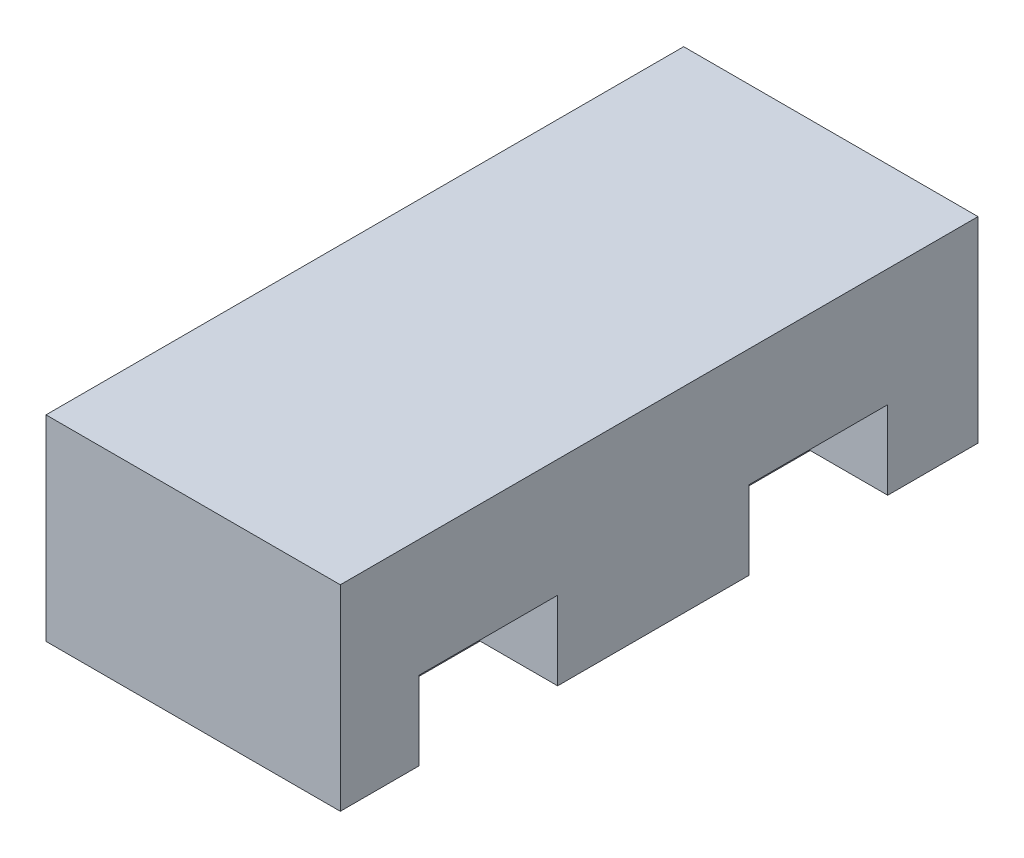
ISO-10303-21;
HEADER;
FILE_DESCRIPTION(('STEP AP214'),'2;1');
FILE_NAME('part.step','',(''),(''),'','','');
FILE_SCHEMA(('AUTOMOTIVE_DESIGN { 1 0 10303 214 1 1 1 1 }'));
ENDSEC;
DATA;
#1=APPLICATION_CONTEXT('core data for automotive mechanical design processes');
#2=APPLICATION_PROTOCOL_DEFINITION('international standard','automotive_design',2000,#1);
#3=PRODUCT_CONTEXT('',#1,'mechanical');
#4=PRODUCT('Part','Part','',(#3));
#5=PRODUCT_RELATED_PRODUCT_CATEGORY('part','',(#4));
#6=PRODUCT_DEFINITION_FORMATION('','',#4);
#7=PRODUCT_DEFINITION_CONTEXT('part definition',#1,'design');
#8=PRODUCT_DEFINITION('design','',#6,#7);
#9=PRODUCT_DEFINITION_SHAPE('','',#8);
#10=(LENGTH_UNIT() NAMED_UNIT(*) SI_UNIT(.MILLI.,.METRE.));
#11=(NAMED_UNIT(*) PLANE_ANGLE_UNIT() SI_UNIT($,.RADIAN.));
#12=(NAMED_UNIT(*) SI_UNIT($,.STERADIAN.) SOLID_ANGLE_UNIT());
#13=UNCERTAINTY_MEASURE_WITH_UNIT(LENGTH_MEASURE(1.E-05),#10,'distance_accuracy_value','');
#14=(GEOMETRIC_REPRESENTATION_CONTEXT(3) GLOBAL_UNCERTAINTY_ASSIGNED_CONTEXT((#13)) GLOBAL_UNIT_ASSIGNED_CONTEXT((#10,
#11,#12)) REPRESENTATION_CONTEXT('',''));
#15=CARTESIAN_POINT('',(0.,0.,0.));
#16=DIRECTION('',(0.,0.,1.));
#17=DIRECTION('',(1.,0.,0.));
#18=AXIS2_PLACEMENT_3D('',#15,#16,#17);
#19=CARTESIAN_POINT('',(-15.,20.,32.5));
#20=DIRECTION('',(-1.,0.,0.));
#21=DIRECTION('',(0.,0.,1.));
#22=AXIS2_PLACEMENT_3D('',#19,#20,#21);
#23=PLANE('',#22);
#24=DIRECTION('',(0.,0.,-1.));
#25=VECTOR('',#24,1.);
#26=CARTESIAN_POINT('',(-15.,0.,32.5));
#27=LINE('',#26,#25);
#28=CARTESIAN_POINT('',(-15.,0.,-23.3));
#29=VERTEX_POINT('',#28);
#30=CARTESIAN_POINT('',(-15.,0.,-32.5));
#31=VERTEX_POINT('',#30);
#32=EDGE_CURVE('E289',#29,#31,#27,.T.);
#33=ORIENTED_EDGE('',*,*,#32,.F.);
#34=DIRECTION('',(0.,-1.,0.));
#35=VECTOR('',#34,1.);
#36=CARTESIAN_POINT('',(-15.,8.,-23.3));
#37=LINE('',#36,#35);
#38=CARTESIAN_POINT('',(-15.,8.,-23.3));
#39=VERTEX_POINT('',#38);
#40=EDGE_CURVE('E211',#39,#29,#37,.T.);
#41=ORIENTED_EDGE('',*,*,#40,.F.);
#42=DIRECTION('',(0.,0.,-1.));
#43=VECTOR('',#42,1.);
#44=CARTESIAN_POINT('',(-15.,8.,0.));
#45=LINE('',#44,#43);
#46=CARTESIAN_POINT('',(-15.,8.,-9.15));
#47=VERTEX_POINT('',#46);
#48=EDGE_CURVE('E195',#47,#39,#45,.T.);
#49=ORIENTED_EDGE('',*,*,#48,.F.);
#50=DIRECTION('',(0.,-1.,0.));
#51=VECTOR('',#50,1.);
#52=CARTESIAN_POINT('',(-15.,8.,-9.15));
#53=LINE('',#52,#51);
#54=CARTESIAN_POINT('',(-15.,0.,-9.15));
#55=VERTEX_POINT('',#54);
#56=EDGE_CURVE('E214',#47,#55,#53,.T.);
#57=ORIENTED_EDGE('',*,*,#56,.T.);
#58=CARTESIAN_POINT('',(-15.,0.,10.35));
#59=VERTEX_POINT('',#58);
#60=EDGE_CURVE('E312',#59,#55,#27,.T.);
#61=ORIENTED_EDGE('',*,*,#60,.F.);
#62=DIRECTION('',(0.,-1.,0.));
#63=VECTOR('',#62,1.);
#64=CARTESIAN_POINT('',(-15.,8.,10.35));
#65=LINE('',#64,#63);
#66=CARTESIAN_POINT('',(-15.,8.,10.35));
#67=VERTEX_POINT('',#66);
#68=EDGE_CURVE('E290',#67,#59,#65,.T.);
#69=ORIENTED_EDGE('',*,*,#68,.F.);
#70=DIRECTION('',(0.,0.,-1.));
#71=VECTOR('',#70,1.);
#72=CARTESIAN_POINT('',(-15.,8.,0.));
#73=LINE('',#72,#71);
#74=CARTESIAN_POINT('',(-15.,8.,24.5));
#75=VERTEX_POINT('',#74);
#76=EDGE_CURVE('E275',#75,#67,#73,.T.);
#77=ORIENTED_EDGE('',*,*,#76,.F.);
#78=DIRECTION('',(0.,-1.,0.));
#79=VECTOR('',#78,1.);
#80=CARTESIAN_POINT('',(-15.,8.,24.5));
#81=LINE('',#80,#79);
#82=CARTESIAN_POINT('',(-15.,0.,24.5));
#83=VERTEX_POINT('',#82);
#84=EDGE_CURVE('E292',#75,#83,#81,.T.);
#85=ORIENTED_EDGE('',*,*,#84,.T.);
#86=CARTESIAN_POINT('',(-15.,0.,32.5));
#87=VERTEX_POINT('',#86);
#88=EDGE_CURVE('E308',#87,#83,#27,.T.);
#89=ORIENTED_EDGE('',*,*,#88,.F.);
#90=DIRECTION('',(0.,-1.,0.));
#91=VECTOR('',#90,1.);
#92=CARTESIAN_POINT('',(-15.,20.,32.5));
#93=LINE('',#92,#91);
#94=CARTESIAN_POINT('',(-15.,20.,32.5));
#95=VERTEX_POINT('',#94);
#96=EDGE_CURVE('E11',#95,#87,#93,.T.);
#97=ORIENTED_EDGE('',*,*,#96,.F.);
#98=DIRECTION('',(0.,0.,-1.));
#99=VECTOR('',#98,1.);
#100=CARTESIAN_POINT('',(-15.,20.,32.5));
#101=LINE('',#100,#99);
#102=CARTESIAN_POINT('',(-15.,20.,-32.5));
#103=VERTEX_POINT('',#102);
#104=EDGE_CURVE('E297',#95,#103,#101,.T.);
#105=ORIENTED_EDGE('',*,*,#104,.T.);
#106=DIRECTION('',(0.,-1.,0.));
#107=VECTOR('',#106,1.);
#108=CARTESIAN_POINT('',(-15.,20.,-32.5));
#109=LINE('',#108,#107);
#110=EDGE_CURVE('E42',#103,#31,#109,.T.);
#111=ORIENTED_EDGE('',*,*,#110,.T.);
#112=EDGE_LOOP('',(#33,#41,#49,#57,#61,#69,#77,#85,#89,#97,#105,#111));
#113=FACE_BOUND('',#112,.T.);
#114=ADVANCED_FACE('F39',(#113),#23,.T.);
#115=CARTESIAN_POINT('',(15.,20.,32.5));
#116=DIRECTION('',(-1.,0.,0.));
#117=DIRECTION('',(0.,0.,1.));
#118=AXIS2_PLACEMENT_3D('',#115,#116,#117);
#119=PLANE('',#118);
#120=DIRECTION('',(0.,-1.,0.));
#121=VECTOR('',#120,1.);
#122=CARTESIAN_POINT('',(15.,8.,24.5));
#123=LINE('',#122,#121);
#124=CARTESIAN_POINT('',(15.,8.,24.5));
#125=VERTEX_POINT('',#124);
#126=CARTESIAN_POINT('',(15.,0.,24.5));
#127=VERTEX_POINT('',#126);
#128=EDGE_CURVE('E233',#125,#127,#123,.T.);
#129=ORIENTED_EDGE('',*,*,#128,.F.);
#130=DIRECTION('',(0.,0.,1.));
#131=VECTOR('',#130,1.);
#132=CARTESIAN_POINT('',(15.,8.,0.));
#133=LINE('',#132,#131);
#134=CARTESIAN_POINT('',(15.,8.,10.35));
#135=VERTEX_POINT('',#134);
#136=EDGE_CURVE('E253',#135,#125,#133,.T.);
#137=ORIENTED_EDGE('',*,*,#136,.F.);
#138=DIRECTION('',(0.,-1.,0.));
#139=VECTOR('',#138,1.);
#140=CARTESIAN_POINT('',(15.,8.,10.35));
#141=LINE('',#140,#139);
#142=CARTESIAN_POINT('',(15.,0.,10.35));
#143=VERTEX_POINT('',#142);
#144=EDGE_CURVE('E263',#135,#143,#141,.T.);
#145=ORIENTED_EDGE('',*,*,#144,.T.);
#146=DIRECTION('',(0.,0.,-1.));
#147=VECTOR('',#146,1.);
#148=CARTESIAN_POINT('',(15.,0.,32.5));
#149=LINE('',#148,#147);
#150=CARTESIAN_POINT('',(15.,0.,-9.15));
#151=VERTEX_POINT('',#150);
#152=EDGE_CURVE('E319',#143,#151,#149,.T.);
#153=ORIENTED_EDGE('',*,*,#152,.T.);
#154=DIRECTION('',(0.,-1.,0.));
#155=VECTOR('',#154,1.);
#156=CARTESIAN_POINT('',(15.,8.,-9.15));
#157=LINE('',#156,#155);
#158=CARTESIAN_POINT('',(15.,8.,-9.15));
#159=VERTEX_POINT('',#158);
#160=EDGE_CURVE('E238',#159,#151,#157,.T.);
#161=ORIENTED_EDGE('',*,*,#160,.F.);
#162=DIRECTION('',(0.,0.,1.));
#163=VECTOR('',#162,1.);
#164=CARTESIAN_POINT('',(15.,8.,0.));
#165=LINE('',#164,#163);
#166=CARTESIAN_POINT('',(15.,8.,-23.3));
#167=VERTEX_POINT('',#166);
#168=EDGE_CURVE('E225',#167,#159,#165,.T.);
#169=ORIENTED_EDGE('',*,*,#168,.F.);
#170=DIRECTION('',(0.,-1.,0.));
#171=VECTOR('',#170,1.);
#172=CARTESIAN_POINT('',(15.,8.,-23.3));
#173=LINE('',#172,#171);
#174=CARTESIAN_POINT('',(15.,0.,-23.3));
#175=VERTEX_POINT('',#174);
#176=EDGE_CURVE('E240',#167,#175,#173,.T.);
#177=ORIENTED_EDGE('',*,*,#176,.T.);
#178=CARTESIAN_POINT('',(15.,0.,-32.5));
#179=VERTEX_POINT('',#178);
#180=EDGE_CURVE('E315',#175,#179,#149,.T.);
#181=ORIENTED_EDGE('',*,*,#180,.T.);
#182=DIRECTION('',(0.,-1.,0.));
#183=VECTOR('',#182,1.);
#184=CARTESIAN_POINT('',(15.,20.,-32.5));
#185=LINE('',#184,#183);
#186=CARTESIAN_POINT('',(15.,20.,-32.5));
#187=VERTEX_POINT('',#186);
#188=EDGE_CURVE('E322',#187,#179,#185,.T.);
#189=ORIENTED_EDGE('',*,*,#188,.F.);
#190=DIRECTION('',(0.,0.,-1.));
#191=VECTOR('',#190,1.);
#192=CARTESIAN_POINT('',(15.,20.,32.5));
#193=LINE('',#192,#191);
#194=CARTESIAN_POINT('',(15.,20.,32.5));
#195=VERTEX_POINT('',#194);
#196=EDGE_CURVE('E304',#195,#187,#193,.T.);
#197=ORIENTED_EDGE('',*,*,#196,.F.);
#198=DIRECTION('',(0.,-1.,0.));
#199=VECTOR('',#198,1.);
#200=CARTESIAN_POINT('',(15.,20.,32.5));
#201=LINE('',#200,#199);
#202=CARTESIAN_POINT('',(15.,0.,32.5));
#203=VERTEX_POINT('',#202);
#204=EDGE_CURVE('E47',#195,#203,#201,.T.);
#205=ORIENTED_EDGE('',*,*,#204,.T.);
#206=EDGE_CURVE('E316',#203,#127,#149,.T.);
#207=ORIENTED_EDGE('',*,*,#206,.T.);
#208=EDGE_LOOP('',(#129,#137,#145,#153,#161,#169,#177,#181,#189,#197,#205,#207));
#209=FACE_BOUND('',#208,.T.);
#210=ADVANCED_FACE('F356',(#209),#119,.F.);
#211=CARTESIAN_POINT('',(0.,0.,0.));
#212=DIRECTION('',(0.,-1.,0.));
#213=DIRECTION('',(0.,0.,-1.));
#214=AXIS2_PLACEMENT_3D('',#211,#212,#213);
#215=PLANE('',#214);
#216=DIRECTION('',(0.,0.,-1.));
#217=VECTOR('',#216,1.);
#218=CARTESIAN_POINT('',(7.1,0.,0.));
#219=LINE('',#218,#217);
#220=CARTESIAN_POINT('',(7.1,0.,24.5));
#221=VERTEX_POINT('',#220);
#222=CARTESIAN_POINT('',(7.1,0.,10.35));
#223=VERTEX_POINT('',#222);
#224=EDGE_CURVE('E258',#221,#223,#219,.T.);
#225=ORIENTED_EDGE('',*,*,#224,.F.);
#226=DIRECTION('',(1.,0.,0.));
#227=VECTOR('',#226,1.);
#228=CARTESIAN_POINT('',(0.,0.,24.5));
#229=LINE('',#228,#227);
#230=EDGE_CURVE('E55',#221,#127,#229,.T.);
#231=ORIENTED_EDGE('',*,*,#230,.T.);
#232=ORIENTED_EDGE('',*,*,#206,.F.);
#233=DIRECTION('',(1.,0.,0.));
#234=VECTOR('',#233,1.);
#235=CARTESIAN_POINT('',(-15.,0.,32.5));
#236=LINE('',#235,#234);
#237=EDGE_CURVE('E301',#87,#203,#236,.T.);
#238=ORIENTED_EDGE('',*,*,#237,.F.);
#239=ORIENTED_EDGE('',*,*,#88,.T.);
#240=DIRECTION('',(-1.,0.,0.));
#241=VECTOR('',#240,1.);
#242=CARTESIAN_POINT('',(0.,0.,24.5));
#243=LINE('',#242,#241);
#244=CARTESIAN_POINT('',(-7.1,0.,24.5));
#245=VERTEX_POINT('',#244);
#246=EDGE_CURVE('E283',#245,#83,#243,.T.);
#247=ORIENTED_EDGE('',*,*,#246,.F.);
#248=DIRECTION('',(0.,0.,-1.));
#249=VECTOR('',#248,1.);
#250=CARTESIAN_POINT('',(-7.1,0.,0.));
#251=LINE('',#250,#249);
#252=CARTESIAN_POINT('',(-7.1,0.,10.35));
#253=VERTEX_POINT('',#252);
#254=EDGE_CURVE('E213',#245,#253,#251,.T.);
#255=ORIENTED_EDGE('',*,*,#254,.T.);
#256=DIRECTION('',(1.,0.,0.));
#257=VECTOR('',#256,1.);
#258=CARTESIAN_POINT('',(0.,0.,10.35));
#259=LINE('',#258,#257);
#260=EDGE_CURVE('E272',#59,#253,#259,.T.);
#261=ORIENTED_EDGE('',*,*,#260,.F.);
#262=ORIENTED_EDGE('',*,*,#60,.T.);
#263=DIRECTION('',(1.,0.,0.));
#264=VECTOR('',#263,1.);
#265=CARTESIAN_POINT('',(0.,0.,-9.15));
#266=LINE('',#265,#264);
#267=CARTESIAN_POINT('',(-7.1,0.,-9.15));
#268=VERTEX_POINT('',#267);
#269=EDGE_CURVE('E200',#55,#268,#266,.T.);
#270=ORIENTED_EDGE('',*,*,#269,.T.);
#271=DIRECTION('',(0.,0.,-1.));
#272=VECTOR('',#271,1.);
#273=CARTESIAN_POINT('',(-7.1,0.,0.));
#274=LINE('',#273,#272);
#275=CARTESIAN_POINT('',(-7.1,0.,-23.3));
#276=VERTEX_POINT('',#275);
#277=EDGE_CURVE('E203',#268,#276,#274,.T.);
#278=ORIENTED_EDGE('',*,*,#277,.T.);
#279=DIRECTION('',(-1.,0.,0.));
#280=VECTOR('',#279,1.);
#281=CARTESIAN_POINT('',(0.,0.,-23.3));
#282=LINE('',#281,#280);
#283=EDGE_CURVE('E194',#276,#29,#282,.T.);
#284=ORIENTED_EDGE('',*,*,#283,.T.);
#285=ORIENTED_EDGE('',*,*,#32,.T.);
#286=DIRECTION('',(1.,0.,0.));
#287=VECTOR('',#286,1.);
#288=CARTESIAN_POINT('',(-15.,0.,-32.5));
#289=LINE('',#288,#287);
#290=EDGE_CURVE('E311',#31,#179,#289,.T.);
#291=ORIENTED_EDGE('',*,*,#290,.T.);
#292=ORIENTED_EDGE('',*,*,#180,.F.);
#293=DIRECTION('',(1.,0.,0.));
#294=VECTOR('',#293,1.);
#295=CARTESIAN_POINT('',(0.,0.,-23.3));
#296=LINE('',#295,#294);
#297=CARTESIAN_POINT('',(7.1,0.,-23.3));
#298=VERTEX_POINT('',#297);
#299=EDGE_CURVE('E232',#298,#175,#296,.T.);
#300=ORIENTED_EDGE('',*,*,#299,.F.);
#301=DIRECTION('',(0.,0.,-1.));
#302=VECTOR('',#301,1.);
#303=CARTESIAN_POINT('',(7.1,0.,0.));
#304=LINE('',#303,#302);
#305=CARTESIAN_POINT('',(7.1,0.,-9.15));
#306=VERTEX_POINT('',#305);
#307=EDGE_CURVE('E63',#306,#298,#304,.T.);
#308=ORIENTED_EDGE('',*,*,#307,.F.);
#309=DIRECTION('',(1.,0.,0.));
#310=VECTOR('',#309,1.);
#311=CARTESIAN_POINT('',(0.,0.,-9.15));
#312=LINE('',#311,#310);
#313=EDGE_CURVE('E222',#306,#151,#312,.T.);
#314=ORIENTED_EDGE('',*,*,#313,.T.);
#315=ORIENTED_EDGE('',*,*,#152,.F.);
#316=DIRECTION('',(1.,0.,0.));
#317=VECTOR('',#316,1.);
#318=CARTESIAN_POINT('',(0.,0.,10.35));
#319=LINE('',#318,#317);
#320=EDGE_CURVE('E247',#223,#143,#319,.T.);
#321=ORIENTED_EDGE('',*,*,#320,.F.);
#322=EDGE_LOOP('',(#225,#231,#232,#238,#239,#247,#255,#261,#262,#270,#278,#284,#285,#291,#292,
#300,#308,#314,#315,#321));
#323=FACE_BOUND('',#322,.T.);
#324=ADVANCED_FACE('F336',(#323),#215,.T.);
#325=CARTESIAN_POINT('',(-15.,20.,32.5));
#326=DIRECTION('',(0.,0.,-1.));
#327=DIRECTION('',(-1.,0.,0.));
#328=AXIS2_PLACEMENT_3D('',#325,#326,#327);
#329=PLANE('',#328);
#330=ORIENTED_EDGE('',*,*,#237,.T.);
#331=ORIENTED_EDGE('',*,*,#204,.F.);
#332=DIRECTION('',(1.,0.,0.));
#333=VECTOR('',#332,1.);
#334=CARTESIAN_POINT('',(-15.,20.,32.5));
#335=LINE('',#334,#333);
#336=EDGE_CURVE('E306',#95,#195,#335,.T.);
#337=ORIENTED_EDGE('',*,*,#336,.F.);
#338=ORIENTED_EDGE('',*,*,#96,.T.);
#339=EDGE_LOOP('',(#330,#331,#337,#338));
#340=FACE_BOUND('',#339,.T.);
#341=ADVANCED_FACE('F365',(#340),#329,.F.);
#342=CARTESIAN_POINT('',(-15.,20.,-32.5));
#343=DIRECTION('',(0.,0.,-1.));
#344=DIRECTION('',(-1.,0.,0.));
#345=AXIS2_PLACEMENT_3D('',#342,#343,#344);
#346=PLANE('',#345);
#347=ORIENTED_EDGE('',*,*,#290,.F.);
#348=ORIENTED_EDGE('',*,*,#110,.F.);
#349=DIRECTION('',(1.,0.,0.));
#350=VECTOR('',#349,1.);
#351=CARTESIAN_POINT('',(-15.,20.,-32.5));
#352=LINE('',#351,#350);
#353=EDGE_CURVE('E300',#103,#187,#352,.T.);
#354=ORIENTED_EDGE('',*,*,#353,.T.);
#355=ORIENTED_EDGE('',*,*,#188,.T.);
#356=EDGE_LOOP('',(#347,#348,#354,#355));
#357=FACE_BOUND('',#356,.T.);
#358=ADVANCED_FACE('F332',(#357),#346,.T.);
#359=CARTESIAN_POINT('',(0.,20.,0.));
#360=DIRECTION('',(0.,-1.,0.));
#361=DIRECTION('',(0.,0.,-1.));
#362=AXIS2_PLACEMENT_3D('',#359,#360,#361);
#363=PLANE('',#362);
#364=ORIENTED_EDGE('',*,*,#104,.F.);
#365=ORIENTED_EDGE('',*,*,#336,.T.);
#366=ORIENTED_EDGE('',*,*,#196,.T.);
#367=ORIENTED_EDGE('',*,*,#353,.F.);
#368=EDGE_LOOP('',(#364,#365,#366,#367));
#369=FACE_BOUND('',#368,.T.);
#370=ADVANCED_FACE('F370',(#369),#363,.F.);
#371=CARTESIAN_POINT('',(-7.1,8.,0.));
#372=DIRECTION('',(-1.,0.,0.));
#373=DIRECTION('',(0.,0.,1.));
#374=AXIS2_PLACEMENT_3D('',#371,#372,#373);
#375=PLANE('',#374);
#376=ORIENTED_EDGE('',*,*,#254,.F.);
#377=DIRECTION('',(0.,-1.,0.));
#378=VECTOR('',#377,1.);
#379=CARTESIAN_POINT('',(-7.1,8.,24.5));
#380=LINE('',#379,#378);
#381=CARTESIAN_POINT('',(-7.1,8.,24.5));
#382=VERTEX_POINT('',#381);
#383=EDGE_CURVE('E280',#382,#245,#380,.T.);
#384=ORIENTED_EDGE('',*,*,#383,.F.);
#385=DIRECTION('',(0.,0.,-1.));
#386=VECTOR('',#385,1.);
#387=CARTESIAN_POINT('',(-7.1,8.,0.));
#388=LINE('',#387,#386);
#389=CARTESIAN_POINT('',(-7.1,8.,10.35));
#390=VERTEX_POINT('',#389);
#391=EDGE_CURVE('E269',#382,#390,#388,.T.);
#392=ORIENTED_EDGE('',*,*,#391,.T.);
#393=DIRECTION('',(0.,-1.,0.));
#394=VECTOR('',#393,1.);
#395=CARTESIAN_POINT('',(-7.1,8.,10.35));
#396=LINE('',#395,#394);
#397=EDGE_CURVE('E287',#390,#253,#396,.T.);
#398=ORIENTED_EDGE('',*,*,#397,.T.);
#399=EDGE_LOOP('',(#376,#384,#392,#398));
#400=FACE_BOUND('',#399,.T.);
#401=ADVANCED_FACE('F375',(#400),#375,.T.);
#402=CARTESIAN_POINT('',(0.,8.,10.35));
#403=DIRECTION('',(0.,0.,-1.));
#404=DIRECTION('',(-1.,0.,0.));
#405=AXIS2_PLACEMENT_3D('',#402,#403,#404);
#406=PLANE('',#405);
#407=ORIENTED_EDGE('',*,*,#260,.T.);
#408=ORIENTED_EDGE('',*,*,#397,.F.);
#409=DIRECTION('',(1.,0.,0.));
#410=VECTOR('',#409,1.);
#411=CARTESIAN_POINT('',(0.,8.,10.35));
#412=LINE('',#411,#410);
#413=EDGE_CURVE('E277',#67,#390,#412,.T.);
#414=ORIENTED_EDGE('',*,*,#413,.F.);
#415=ORIENTED_EDGE('',*,*,#68,.T.);
#416=EDGE_LOOP('',(#407,#408,#414,#415));
#417=FACE_BOUND('',#416,.T.);
#418=ADVANCED_FACE('F436',(#417),#406,.F.);
#419=CARTESIAN_POINT('',(0.,8.,24.5));
#420=DIRECTION('',(0.,0.,1.));
#421=DIRECTION('',(1.,0.,0.));
#422=AXIS2_PLACEMENT_3D('',#419,#420,#421);
#423=PLANE('',#422);
#424=ORIENTED_EDGE('',*,*,#246,.T.);
#425=ORIENTED_EDGE('',*,*,#84,.F.);
#426=DIRECTION('',(-1.,0.,0.));
#427=VECTOR('',#426,1.);
#428=CARTESIAN_POINT('',(0.,8.,24.5));
#429=LINE('',#428,#427);
#430=EDGE_CURVE('E271',#382,#75,#429,.T.);
#431=ORIENTED_EDGE('',*,*,#430,.F.);
#432=ORIENTED_EDGE('',*,*,#383,.T.);
#433=EDGE_LOOP('',(#424,#425,#431,#432));
#434=FACE_BOUND('',#433,.T.);
#435=ADVANCED_FACE('F434',(#434),#423,.F.);
#436=CARTESIAN_POINT('',(0.,8.,0.));
#437=DIRECTION('',(0.,-1.,0.));
#438=DIRECTION('',(0.,0.,-1.));
#439=AXIS2_PLACEMENT_3D('',#436,#437,#438);
#440=PLANE('',#439);
#441=ORIENTED_EDGE('',*,*,#391,.F.);
#442=ORIENTED_EDGE('',*,*,#430,.T.);
#443=ORIENTED_EDGE('',*,*,#76,.T.);
#444=ORIENTED_EDGE('',*,*,#413,.T.);
#445=EDGE_LOOP('',(#441,#442,#443,#444));
#446=FACE_BOUND('',#445,.T.);
#447=ADVANCED_FACE('F352',(#446),#440,.T.);
#448=CARTESIAN_POINT('',(0.,8.,-23.3));
#449=DIRECTION('',(0.,0.,1.));
#450=DIRECTION('',(1.,0.,0.));
#451=AXIS2_PLACEMENT_3D('',#448,#449,#450);
#452=PLANE('',#451);
#453=ORIENTED_EDGE('',*,*,#283,.F.);
#454=DIRECTION('',(0.,-1.,0.));
#455=VECTOR('',#454,1.);
#456=CARTESIAN_POINT('',(-7.1,8.,-23.3));
#457=LINE('',#456,#455);
#458=CARTESIAN_POINT('',(-7.1,8.,-23.3));
#459=VERTEX_POINT('',#458);
#460=EDGE_CURVE('E181',#459,#276,#457,.T.);
#461=ORIENTED_EDGE('',*,*,#460,.F.);
#462=DIRECTION('',(-1.,0.,0.));
#463=VECTOR('',#462,1.);
#464=CARTESIAN_POINT('',(0.,8.,-23.3));
#465=LINE('',#464,#463);
#466=EDGE_CURVE('E188',#459,#39,#465,.T.);
#467=ORIENTED_EDGE('',*,*,#466,.T.);
#468=ORIENTED_EDGE('',*,*,#40,.T.);
#469=EDGE_LOOP('',(#453,#461,#467,#468));
#470=FACE_BOUND('',#469,.T.);
#471=ADVANCED_FACE('F191',(#470),#452,.T.);
#472=CARTESIAN_POINT('',(0.,8.,-9.15));
#473=DIRECTION('',(0.,0.,-1.));
#474=DIRECTION('',(-1.,0.,0.));
#475=AXIS2_PLACEMENT_3D('',#472,#473,#474);
#476=PLANE('',#475);
#477=ORIENTED_EDGE('',*,*,#269,.F.);
#478=ORIENTED_EDGE('',*,*,#56,.F.);
#479=DIRECTION('',(1.,0.,0.));
#480=VECTOR('',#479,1.);
#481=CARTESIAN_POINT('',(0.,8.,-9.15));
#482=LINE('',#481,#480);
#483=CARTESIAN_POINT('',(-7.1,8.,-9.15));
#484=VERTEX_POINT('',#483);
#485=EDGE_CURVE('E187',#47,#484,#482,.T.);
#486=ORIENTED_EDGE('',*,*,#485,.T.);
#487=DIRECTION('',(0.,-1.,0.));
#488=VECTOR('',#487,1.);
#489=CARTESIAN_POINT('',(-7.1,8.,-9.15));
#490=LINE('',#489,#488);
#491=EDGE_CURVE('E183',#484,#268,#490,.T.);
#492=ORIENTED_EDGE('',*,*,#491,.T.);
#493=EDGE_LOOP('',(#477,#478,#486,#492));
#494=FACE_BOUND('',#493,.T.);
#495=ADVANCED_FACE('F344',(#494),#476,.T.);
#496=CARTESIAN_POINT('',(-7.1,8.,0.));
#497=DIRECTION('',(-1.,0.,0.));
#498=DIRECTION('',(0.,0.,1.));
#499=AXIS2_PLACEMENT_3D('',#496,#497,#498);
#500=PLANE('',#499);
#501=ORIENTED_EDGE('',*,*,#277,.F.);
#502=ORIENTED_EDGE('',*,*,#491,.F.);
#503=DIRECTION('',(0.,0.,-1.));
#504=VECTOR('',#503,1.);
#505=CARTESIAN_POINT('',(-7.1,8.,0.));
#506=LINE('',#505,#504);
#507=EDGE_CURVE('E177',#484,#459,#506,.T.);
#508=ORIENTED_EDGE('',*,*,#507,.T.);
#509=ORIENTED_EDGE('',*,*,#460,.T.);
#510=EDGE_LOOP('',(#501,#502,#508,#509));
#511=FACE_BOUND('',#510,.T.);
#512=ADVANCED_FACE('F180',(#511),#500,.T.);
#513=CARTESIAN_POINT('',(0.,8.,0.));
#514=DIRECTION('',(0.,-1.,0.));
#515=DIRECTION('',(0.,0.,-1.));
#516=AXIS2_PLACEMENT_3D('',#513,#514,#515);
#517=PLANE('',#516);
#518=ORIENTED_EDGE('',*,*,#466,.F.);
#519=ORIENTED_EDGE('',*,*,#507,.F.);
#520=ORIENTED_EDGE('',*,*,#485,.F.);
#521=ORIENTED_EDGE('',*,*,#48,.T.);
#522=EDGE_LOOP('',(#518,#519,#520,#521));
#523=FACE_BOUND('',#522,.T.);
#524=ADVANCED_FACE('F197',(#523),#517,.T.);
#525=CARTESIAN_POINT('',(7.1,8.,0.));
#526=DIRECTION('',(-1.,0.,0.));
#527=DIRECTION('',(0.,0.,1.));
#528=AXIS2_PLACEMENT_3D('',#525,#526,#527);
#529=PLANE('',#528);
#530=ORIENTED_EDGE('',*,*,#307,.T.);
#531=DIRECTION('',(0.,-1.,0.));
#532=VECTOR('',#531,1.);
#533=CARTESIAN_POINT('',(7.1,8.,-23.3));
#534=LINE('',#533,#532);
#535=CARTESIAN_POINT('',(7.1,8.,-23.3));
#536=VERTEX_POINT('',#535);
#537=EDGE_CURVE('E230',#536,#298,#534,.T.);
#538=ORIENTED_EDGE('',*,*,#537,.F.);
#539=DIRECTION('',(0.,0.,-1.));
#540=VECTOR('',#539,1.);
#541=CARTESIAN_POINT('',(7.1,8.,0.));
#542=LINE('',#541,#540);
#543=CARTESIAN_POINT('',(7.1,8.,-9.15));
#544=VERTEX_POINT('',#543);
#545=EDGE_CURVE('E218',#544,#536,#542,.T.);
#546=ORIENTED_EDGE('',*,*,#545,.F.);
#547=DIRECTION('',(0.,-1.,0.));
#548=VECTOR('',#547,1.);
#549=CARTESIAN_POINT('',(7.1,8.,-9.15));
#550=LINE('',#549,#548);
#551=EDGE_CURVE('E209',#544,#306,#550,.T.);
#552=ORIENTED_EDGE('',*,*,#551,.T.);
#553=EDGE_LOOP('',(#530,#538,#546,#552));
#554=FACE_BOUND('',#553,.T.);
#555=ADVANCED_FACE('F410',(#554),#529,.F.);
#556=CARTESIAN_POINT('',(0.,8.,-9.15));
#557=DIRECTION('',(0.,0.,-1.));
#558=DIRECTION('',(-1.,0.,0.));
#559=AXIS2_PLACEMENT_3D('',#556,#557,#558);
#560=PLANE('',#559);
#561=ORIENTED_EDGE('',*,*,#313,.F.);
#562=ORIENTED_EDGE('',*,*,#551,.F.);
#563=DIRECTION('',(1.,0.,0.));
#564=VECTOR('',#563,1.);
#565=CARTESIAN_POINT('',(0.,8.,-9.15));
#566=LINE('',#565,#564);
#567=EDGE_CURVE('E228',#544,#159,#566,.T.);
#568=ORIENTED_EDGE('',*,*,#567,.T.);
#569=ORIENTED_EDGE('',*,*,#160,.T.);
#570=EDGE_LOOP('',(#561,#562,#568,#569));
#571=FACE_BOUND('',#570,.T.);
#572=ADVANCED_FACE('F412',(#571),#560,.T.);
#573=CARTESIAN_POINT('',(0.,8.,-23.3));
#574=DIRECTION('',(0.,0.,-1.));
#575=DIRECTION('',(-1.,0.,0.));
#576=AXIS2_PLACEMENT_3D('',#573,#574,#575);
#577=PLANE('',#576);
#578=ORIENTED_EDGE('',*,*,#299,.T.);
#579=ORIENTED_EDGE('',*,*,#176,.F.);
#580=DIRECTION('',(1.,0.,0.));
#581=VECTOR('',#580,1.);
#582=CARTESIAN_POINT('',(0.,8.,-23.3));
#583=LINE('',#582,#581);
#584=EDGE_CURVE('E221',#536,#167,#583,.T.);
#585=ORIENTED_EDGE('',*,*,#584,.F.);
#586=ORIENTED_EDGE('',*,*,#537,.T.);
#587=EDGE_LOOP('',(#578,#579,#585,#586));
#588=FACE_BOUND('',#587,.T.);
#589=ADVANCED_FACE('F405',(#588),#577,.F.);
#590=CARTESIAN_POINT('',(0.,8.,0.));
#591=DIRECTION('',(0.,-1.,0.));
#592=DIRECTION('',(0.,0.,-1.));
#593=AXIS2_PLACEMENT_3D('',#590,#591,#592);
#594=PLANE('',#593);
#595=ORIENTED_EDGE('',*,*,#545,.T.);
#596=ORIENTED_EDGE('',*,*,#584,.T.);
#597=ORIENTED_EDGE('',*,*,#168,.T.);
#598=ORIENTED_EDGE('',*,*,#567,.F.);
#599=EDGE_LOOP('',(#595,#596,#597,#598));
#600=FACE_BOUND('',#599,.T.);
#601=ADVANCED_FACE('F407',(#600),#594,.T.);
#602=CARTESIAN_POINT('',(0.,8.,24.5));
#603=DIRECTION('',(0.,0.,-1.));
#604=DIRECTION('',(-1.,0.,0.));
#605=AXIS2_PLACEMENT_3D('',#602,#603,#604);
#606=PLANE('',#605);
#607=ORIENTED_EDGE('',*,*,#230,.F.);
#608=DIRECTION('',(0.,-1.,0.));
#609=VECTOR('',#608,1.);
#610=CARTESIAN_POINT('',(7.1,8.,24.5));
#611=LINE('',#610,#609);
#612=CARTESIAN_POINT('',(7.1,8.,24.5));
#613=VERTEX_POINT('',#612);
#614=EDGE_CURVE('E256',#613,#221,#611,.T.);
#615=ORIENTED_EDGE('',*,*,#614,.F.);
#616=DIRECTION('',(1.,0.,0.));
#617=VECTOR('',#616,1.);
#618=CARTESIAN_POINT('',(0.,8.,24.5));
#619=LINE('',#618,#617);
#620=EDGE_CURVE('E244',#613,#125,#619,.T.);
#621=ORIENTED_EDGE('',*,*,#620,.T.);
#622=ORIENTED_EDGE('',*,*,#128,.T.);
#623=EDGE_LOOP('',(#607,#615,#621,#622));
#624=FACE_BOUND('',#623,.T.);
#625=ADVANCED_FACE('F394',(#624),#606,.T.);
#626=CARTESIAN_POINT('',(0.,8.,10.35));
#627=DIRECTION('',(0.,0.,-1.));
#628=DIRECTION('',(-1.,0.,0.));
#629=AXIS2_PLACEMENT_3D('',#626,#627,#628);
#630=PLANE('',#629);
#631=ORIENTED_EDGE('',*,*,#320,.T.);
#632=ORIENTED_EDGE('',*,*,#144,.F.);
#633=DIRECTION('',(1.,0.,0.));
#634=VECTOR('',#633,1.);
#635=CARTESIAN_POINT('',(0.,8.,10.35));
#636=LINE('',#635,#634);
#637=CARTESIAN_POINT('',(7.1,8.,10.35));
#638=VERTEX_POINT('',#637);
#639=EDGE_CURVE('E250',#638,#135,#636,.T.);
#640=ORIENTED_EDGE('',*,*,#639,.F.);
#641=DIRECTION('',(0.,-1.,0.));
#642=VECTOR('',#641,1.);
#643=CARTESIAN_POINT('',(7.1,8.,10.35));
#644=LINE('',#643,#642);
#645=EDGE_CURVE('E266',#638,#223,#644,.T.);
#646=ORIENTED_EDGE('',*,*,#645,.T.);
#647=EDGE_LOOP('',(#631,#632,#640,#646));
#648=FACE_BOUND('',#647,.T.);
#649=ADVANCED_FACE('F425',(#648),#630,.F.);
#650=CARTESIAN_POINT('',(7.1,8.,0.));
#651=DIRECTION('',(-1.,0.,0.));
#652=DIRECTION('',(0.,0.,1.));
#653=AXIS2_PLACEMENT_3D('',#650,#651,#652);
#654=PLANE('',#653);
#655=ORIENTED_EDGE('',*,*,#224,.T.);
#656=ORIENTED_EDGE('',*,*,#645,.F.);
#657=DIRECTION('',(0.,0.,-1.));
#658=VECTOR('',#657,1.);
#659=CARTESIAN_POINT('',(7.1,8.,0.));
#660=LINE('',#659,#658);
#661=EDGE_CURVE('E246',#613,#638,#660,.T.);
#662=ORIENTED_EDGE('',*,*,#661,.F.);
#663=ORIENTED_EDGE('',*,*,#614,.T.);
#664=EDGE_LOOP('',(#655,#656,#662,#663));
#665=FACE_BOUND('',#664,.T.);
#666=ADVANCED_FACE('F390',(#665),#654,.F.);
#667=CARTESIAN_POINT('',(0.,8.,0.));
#668=DIRECTION('',(0.,-1.,0.));
#669=DIRECTION('',(0.,0.,-1.));
#670=AXIS2_PLACEMENT_3D('',#667,#668,#669);
#671=PLANE('',#670);
#672=ORIENTED_EDGE('',*,*,#620,.F.);
#673=ORIENTED_EDGE('',*,*,#661,.T.);
#674=ORIENTED_EDGE('',*,*,#639,.T.);
#675=ORIENTED_EDGE('',*,*,#136,.T.);
#676=EDGE_LOOP('',(#672,#673,#674,#675));
#677=FACE_BOUND('',#676,.T.);
#678=ADVANCED_FACE('F396',(#677),#671,.T.);
#679=CLOSED_SHELL('',(#114,#210,#324,#341,#358,#370,#401,#418,#435,#447,#471,#495,#512,#524,
#555,#572,#589,#601,#625,#649,#666,#678));
#680=MANIFOLD_SOLID_BREP('B2',#679);
#681=ADVANCED_BREP_SHAPE_REPRESENTATION('',(#18,#680),#14);
#682=SHAPE_DEFINITION_REPRESENTATION(#9,#681);
ENDSEC;
END-ISO-10303-21;
